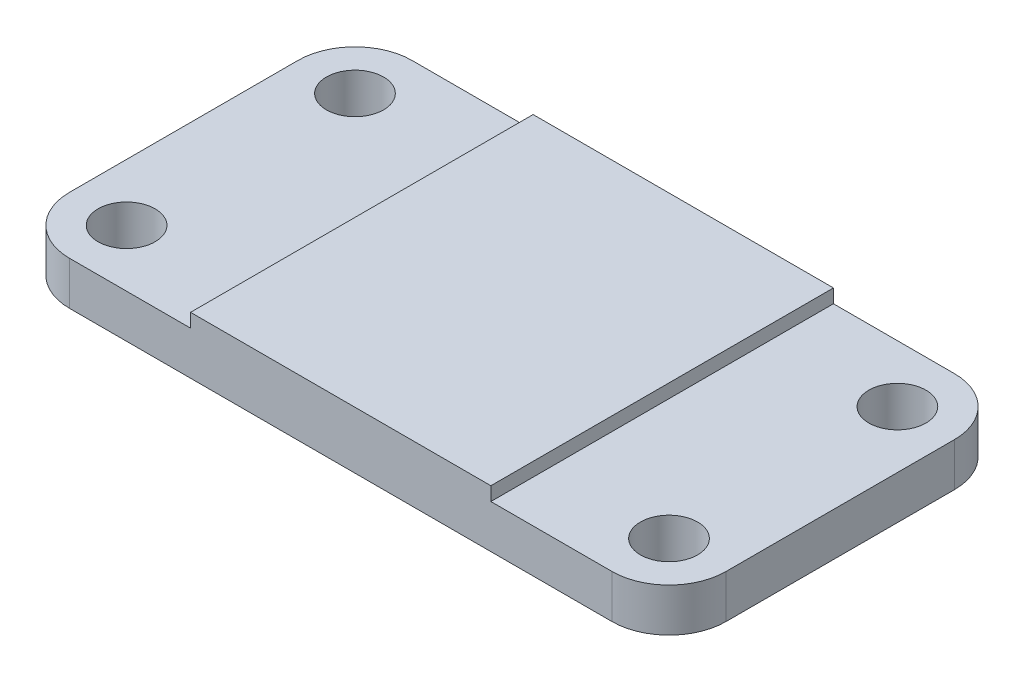
ISO-10303-21;
HEADER;
FILE_DESCRIPTION(('STEP AP214'),'2;1');
FILE_NAME('part.step','',(''),(''),'','','');
FILE_SCHEMA(('AUTOMOTIVE_DESIGN { 1 0 10303 214 1 1 1 1 }'));
ENDSEC;
DATA;
#1=APPLICATION_CONTEXT('core data for automotive mechanical design processes');
#2=APPLICATION_PROTOCOL_DEFINITION('international standard','automotive_design',2000,#1);
#3=PRODUCT_CONTEXT('',#1,'mechanical');
#4=PRODUCT('Part','Part','',(#3));
#5=PRODUCT_RELATED_PRODUCT_CATEGORY('part','',(#4));
#6=PRODUCT_DEFINITION_FORMATION('','',#4);
#7=PRODUCT_DEFINITION_CONTEXT('part definition',#1,'design');
#8=PRODUCT_DEFINITION('design','',#6,#7);
#9=PRODUCT_DEFINITION_SHAPE('','',#8);
#10=(LENGTH_UNIT() NAMED_UNIT(*) SI_UNIT(.MILLI.,.METRE.));
#11=(NAMED_UNIT(*) PLANE_ANGLE_UNIT() SI_UNIT($,.RADIAN.));
#12=(NAMED_UNIT(*) SI_UNIT($,.STERADIAN.) SOLID_ANGLE_UNIT());
#13=UNCERTAINTY_MEASURE_WITH_UNIT(LENGTH_MEASURE(1.E-05),#10,'distance_accuracy_value','');
#14=(GEOMETRIC_REPRESENTATION_CONTEXT(3) GLOBAL_UNCERTAINTY_ASSIGNED_CONTEXT((#13)) GLOBAL_UNIT_ASSIGNED_CONTEXT((#10,
#11,#12)) REPRESENTATION_CONTEXT('',''));
#15=CARTESIAN_POINT('',(0.,0.,0.));
#16=DIRECTION('',(0.,0.,1.));
#17=DIRECTION('',(1.,0.,0.));
#18=AXIS2_PLACEMENT_3D('',#15,#16,#17);
#19=CARTESIAN_POINT('',(0.,9.652,0.));
#20=DIRECTION('',(0.,-1.,0.));
#21=DIRECTION('',(0.,0.,-1.));
#22=AXIS2_PLACEMENT_3D('',#19,#20,#21);
#23=PLANE('',#22);
#24=CARTESIAN_POINT('',(60.325,9.652,25.4));
#25=DIRECTION('',(0.,1.,0.));
#26=DIRECTION('',(0.,0.,1.));
#27=AXIS2_PLACEMENT_3D('',#24,#25,#26);
#28=CIRCLE('',#27,6.34999999999999);
#29=CARTESIAN_POINT('',(60.325,9.652,31.75));
#30=VERTEX_POINT('',#29);
#31=EDGE_CURVE('E244',#30,#30,#28,.T.);
#32=ORIENTED_EDGE('',*,*,#31,.F.);
#33=EDGE_LOOP('',(#32));
#34=FACE_BOUND('',#33,.T.);
#35=CARTESIAN_POINT('',(60.325,9.652,-25.4));
#36=DIRECTION('',(0.,1.,0.));
#37=DIRECTION('',(0.,0.,1.));
#38=AXIS2_PLACEMENT_3D('',#35,#36,#37);
#39=CIRCLE('',#38,6.34999999999999);
#40=CARTESIAN_POINT('',(60.325,9.652,-19.05));
#41=VERTEX_POINT('',#40);
#42=EDGE_CURVE('E238',#41,#41,#39,.T.);
#43=ORIENTED_EDGE('',*,*,#42,.F.);
#44=EDGE_LOOP('',(#43));
#45=FACE_BOUND('',#44,.T.);
#46=DIRECTION('',(0.,0.,-1.));
#47=VECTOR('',#46,1.);
#48=CARTESIAN_POINT('',(73.025,9.652,38.1));
#49=LINE('',#48,#47);
#50=CARTESIAN_POINT('',(73.025,9.652,25.4));
#51=VERTEX_POINT('',#50);
#52=CARTESIAN_POINT('',(73.025,9.652,-25.4));
#53=VERTEX_POINT('',#52);
#54=EDGE_CURVE('E159',#51,#53,#49,.T.);
#55=ORIENTED_EDGE('',*,*,#54,.T.);
#56=CARTESIAN_POINT('',(60.325,9.652,-25.4));
#57=DIRECTION('',(0.,-1.,0.));
#58=DIRECTION('',(0.,0.,-1.));
#59=AXIS2_PLACEMENT_3D('',#56,#57,#58);
#60=CIRCLE('',#59,12.7);
#61=CARTESIAN_POINT('',(60.325,9.652,-38.1));
#62=VERTEX_POINT('',#61);
#63=EDGE_CURVE('E11',#53,#62,#60,.F.);
#64=ORIENTED_EDGE('',*,*,#63,.T.);
#65=DIRECTION('',(-1.,0.,0.));
#66=VECTOR('',#65,1.);
#67=CARTESIAN_POINT('',(-73.025,9.652,-38.1));
#68=LINE('',#67,#66);
#69=CARTESIAN_POINT('',(33.401,9.652,-38.1));
#70=VERTEX_POINT('',#69);
#71=EDGE_CURVE('E163',#62,#70,#68,.T.);
#72=ORIENTED_EDGE('',*,*,#71,.T.);
#73=DIRECTION('',(0.,0.,-1.));
#74=VECTOR('',#73,1.);
#75=CARTESIAN_POINT('',(33.401,9.652,-38.1));
#76=LINE('',#75,#74);
#77=CARTESIAN_POINT('',(33.401,9.652,38.1));
#78=VERTEX_POINT('',#77);
#79=EDGE_CURVE('E150',#78,#70,#76,.T.);
#80=ORIENTED_EDGE('',*,*,#79,.F.);
#81=DIRECTION('',(1.,0.,0.));
#82=VECTOR('',#81,1.);
#83=CARTESIAN_POINT('',(-73.025,9.652,38.1));
#84=LINE('',#83,#82);
#85=CARTESIAN_POINT('',(60.325,9.652,38.1));
#86=VERTEX_POINT('',#85);
#87=EDGE_CURVE('E168',#78,#86,#84,.T.);
#88=ORIENTED_EDGE('',*,*,#87,.T.);
#89=CARTESIAN_POINT('',(60.325,9.652,25.4));
#90=DIRECTION('',(0.,-1.,0.));
#91=DIRECTION('',(0.,0.,-1.));
#92=AXIS2_PLACEMENT_3D('',#89,#90,#91);
#93=CIRCLE('',#92,12.7);
#94=EDGE_CURVE('E43',#86,#51,#93,.F.);
#95=ORIENTED_EDGE('',*,*,#94,.T.);
#96=EDGE_LOOP('',(#55,#64,#72,#80,#88,#95));
#97=FACE_BOUND('',#96,.T.);
#98=ADVANCED_FACE('F35',(#34,#45,#97),#23,.F.);
#99=CARTESIAN_POINT('',(-60.325,9.652,-25.4));
#100=DIRECTION('',(0.,1.,0.));
#101=DIRECTION('',(0.,0.,1.));
#102=AXIS2_PLACEMENT_3D('',#99,#100,#101);
#103=CIRCLE('',#102,6.35);
#104=CARTESIAN_POINT('',(-60.325,9.652,-19.05));
#105=VERTEX_POINT('',#104);
#106=EDGE_CURVE('E256',#105,#105,#103,.T.);
#107=ORIENTED_EDGE('',*,*,#106,.F.);
#108=EDGE_LOOP('',(#107));
#109=FACE_BOUND('',#108,.T.);
#110=CARTESIAN_POINT('',(-60.325,9.652,25.4));
#111=DIRECTION('',(0.,1.,0.));
#112=DIRECTION('',(0.,0.,1.));
#113=AXIS2_PLACEMENT_3D('',#110,#111,#112);
#114=CIRCLE('',#113,6.35);
#115=CARTESIAN_POINT('',(-60.325,9.652,31.75));
#116=VERTEX_POINT('',#115);
#117=EDGE_CURVE('E250',#116,#116,#114,.T.);
#118=ORIENTED_EDGE('',*,*,#117,.F.);
#119=EDGE_LOOP('',(#118));
#120=FACE_BOUND('',#119,.T.);
#121=CARTESIAN_POINT('',(-33.401,9.652,-38.1));
#122=VERTEX_POINT('',#121);
#123=CARTESIAN_POINT('',(-60.325,9.652,-38.1));
#124=VERTEX_POINT('',#123);
#125=EDGE_CURVE('E161',#122,#124,#68,.T.);
#126=ORIENTED_EDGE('',*,*,#125,.T.);
#127=CARTESIAN_POINT('',(-60.325,9.652,-25.4));
#128=DIRECTION('',(0.,-1.,0.));
#129=DIRECTION('',(0.,0.,-1.));
#130=AXIS2_PLACEMENT_3D('',#127,#128,#129);
#131=CIRCLE('',#130,12.7);
#132=CARTESIAN_POINT('',(-73.025,9.652,-25.4));
#133=VERTEX_POINT('',#132);
#134=EDGE_CURVE('E197',#124,#133,#131,.F.);
#135=ORIENTED_EDGE('',*,*,#134,.T.);
#136=DIRECTION('',(0.,0.,1.));
#137=VECTOR('',#136,1.);
#138=CARTESIAN_POINT('',(-73.025,9.652,38.1));
#139=LINE('',#138,#137);
#140=CARTESIAN_POINT('',(-73.025,9.652,25.4));
#141=VERTEX_POINT('',#140);
#142=EDGE_CURVE('E165',#133,#141,#139,.T.);
#143=ORIENTED_EDGE('',*,*,#142,.T.);
#144=CARTESIAN_POINT('',(-60.325,9.652,25.4));
#145=DIRECTION('',(0.,-1.,0.));
#146=DIRECTION('',(0.,0.,-1.));
#147=AXIS2_PLACEMENT_3D('',#144,#145,#146);
#148=CIRCLE('',#147,12.7);
#149=CARTESIAN_POINT('',(-60.325,9.652,38.1));
#150=VERTEX_POINT('',#149);
#151=EDGE_CURVE('E195',#141,#150,#148,.F.);
#152=ORIENTED_EDGE('',*,*,#151,.T.);
#153=CARTESIAN_POINT('',(-33.401,9.652,38.1));
#154=VERTEX_POINT('',#153);
#155=EDGE_CURVE('E169',#150,#154,#84,.T.);
#156=ORIENTED_EDGE('',*,*,#155,.T.);
#157=DIRECTION('',(0.,0.,1.));
#158=VECTOR('',#157,1.);
#159=CARTESIAN_POINT('',(-33.401,9.652,-38.1));
#160=LINE('',#159,#158);
#161=EDGE_CURVE('E147',#122,#154,#160,.T.);
#162=ORIENTED_EDGE('',*,*,#161,.F.);
#163=EDGE_LOOP('',(#126,#135,#143,#152,#156,#162));
#164=FACE_BOUND('',#163,.T.);
#165=ADVANCED_FACE('F262',(#109,#120,#164),#23,.F.);
#166=CARTESIAN_POINT('',(73.025,9.652,38.1));
#167=DIRECTION('',(-1.,0.,0.));
#168=DIRECTION('',(0.,0.,1.));
#169=AXIS2_PLACEMENT_3D('',#166,#167,#168);
#170=PLANE('',#169);
#171=DIRECTION('',(0.,0.,-1.));
#172=VECTOR('',#171,1.);
#173=CARTESIAN_POINT('',(73.025,0.,38.1));
#174=LINE('',#173,#172);
#175=CARTESIAN_POINT('',(73.025,0.,25.4));
#176=VERTEX_POINT('',#175);
#177=CARTESIAN_POINT('',(73.025,0.,-25.4));
#178=VERTEX_POINT('',#177);
#179=EDGE_CURVE('E151',#176,#178,#174,.T.);
#180=ORIENTED_EDGE('',*,*,#179,.T.);
#181=DIRECTION('',(0.,-1.,0.));
#182=VECTOR('',#181,1.);
#183=CARTESIAN_POINT('',(73.025,9.652,-25.4));
#184=LINE('',#183,#182);
#185=EDGE_CURVE('E50',#178,#53,#184,.F.);
#186=ORIENTED_EDGE('',*,*,#185,.T.);
#187=ORIENTED_EDGE('',*,*,#54,.F.);
#188=DIRECTION('',(0.,-1.,0.));
#189=VECTOR('',#188,1.);
#190=CARTESIAN_POINT('',(73.025,9.652,25.4));
#191=LINE('',#190,#189);
#192=EDGE_CURVE('E204',#51,#176,#191,.T.);
#193=ORIENTED_EDGE('',*,*,#192,.T.);
#194=EDGE_LOOP('',(#180,#186,#187,#193));
#195=FACE_BOUND('',#194,.T.);
#196=ADVANCED_FACE('F209',(#195),#170,.F.);
#197=CARTESIAN_POINT('',(-73.025,9.652,-38.1));
#198=DIRECTION('',(0.,0.,1.));
#199=DIRECTION('',(1.,0.,0.));
#200=AXIS2_PLACEMENT_3D('',#197,#198,#199);
#201=PLANE('',#200);
#202=DIRECTION('',(-1.,0.,0.));
#203=VECTOR('',#202,1.);
#204=CARTESIAN_POINT('',(-73.025,0.,-38.1));
#205=LINE('',#204,#203);
#206=CARTESIAN_POINT('',(60.325,0.,-38.1));
#207=VERTEX_POINT('',#206);
#208=CARTESIAN_POINT('',(-60.325,0.,-38.1));
#209=VERTEX_POINT('',#208);
#210=EDGE_CURVE('E153',#207,#209,#205,.T.);
#211=ORIENTED_EDGE('',*,*,#210,.T.);
#212=DIRECTION('',(0.,-1.,0.));
#213=VECTOR('',#212,1.);
#214=CARTESIAN_POINT('',(-60.325,9.652,-38.1));
#215=LINE('',#214,#213);
#216=EDGE_CURVE('E193',#209,#124,#215,.F.);
#217=ORIENTED_EDGE('',*,*,#216,.T.);
#218=ORIENTED_EDGE('',*,*,#125,.F.);
#219=DIRECTION('',(0.,-1.,0.));
#220=VECTOR('',#219,1.);
#221=CARTESIAN_POINT('',(-33.401,12.7,-38.1));
#222=LINE('',#221,#220);
#223=CARTESIAN_POINT('',(-33.401,12.7,-38.1));
#224=VERTEX_POINT('',#223);
#225=EDGE_CURVE('E134',#224,#122,#222,.T.);
#226=ORIENTED_EDGE('',*,*,#225,.F.);
#227=DIRECTION('',(-1.,0.,0.));
#228=VECTOR('',#227,1.);
#229=CARTESIAN_POINT('',(-33.401,12.7,-38.1));
#230=LINE('',#229,#228);
#231=CARTESIAN_POINT('',(33.401,12.7,-38.1));
#232=VERTEX_POINT('',#231);
#233=EDGE_CURVE('E124',#232,#224,#230,.T.);
#234=ORIENTED_EDGE('',*,*,#233,.F.);
#235=DIRECTION('',(0.,-1.,0.));
#236=VECTOR('',#235,1.);
#237=CARTESIAN_POINT('',(33.401,12.7,-38.1));
#238=LINE('',#237,#236);
#239=EDGE_CURVE('E130',#232,#70,#238,.T.);
#240=ORIENTED_EDGE('',*,*,#239,.T.);
#241=ORIENTED_EDGE('',*,*,#71,.F.);
#242=DIRECTION('',(0.,-1.,0.));
#243=VECTOR('',#242,1.);
#244=CARTESIAN_POINT('',(60.325,9.652,-38.1));
#245=LINE('',#244,#243);
#246=EDGE_CURVE('E190',#62,#207,#245,.T.);
#247=ORIENTED_EDGE('',*,*,#246,.T.);
#248=EDGE_LOOP('',(#211,#217,#218,#226,#234,#240,#241,#247));
#249=FACE_BOUND('',#248,.T.);
#250=ADVANCED_FACE('F127',(#249),#201,.F.);
#251=CARTESIAN_POINT('',(-73.025,9.652,38.1));
#252=DIRECTION('',(1.,0.,0.));
#253=DIRECTION('',(0.,0.,-1.));
#254=AXIS2_PLACEMENT_3D('',#251,#252,#253);
#255=PLANE('',#254);
#256=ORIENTED_EDGE('',*,*,#142,.F.);
#257=DIRECTION('',(0.,-1.,0.));
#258=VECTOR('',#257,1.);
#259=CARTESIAN_POINT('',(-73.025,9.652,-25.4));
#260=LINE('',#259,#258);
#261=CARTESIAN_POINT('',(-73.025,0.,-25.4));
#262=VERTEX_POINT('',#261);
#263=EDGE_CURVE('E179',#133,#262,#260,.T.);
#264=ORIENTED_EDGE('',*,*,#263,.T.);
#265=DIRECTION('',(0.,0.,1.));
#266=VECTOR('',#265,1.);
#267=CARTESIAN_POINT('',(-73.025,0.,38.1));
#268=LINE('',#267,#266);
#269=CARTESIAN_POINT('',(-73.025,0.,25.4));
#270=VERTEX_POINT('',#269);
#271=EDGE_CURVE('E173',#262,#270,#268,.T.);
#272=ORIENTED_EDGE('',*,*,#271,.T.);
#273=DIRECTION('',(0.,-1.,0.));
#274=VECTOR('',#273,1.);
#275=CARTESIAN_POINT('',(-73.025,9.652,25.4));
#276=LINE('',#275,#274);
#277=EDGE_CURVE('E170',#270,#141,#276,.F.);
#278=ORIENTED_EDGE('',*,*,#277,.T.);
#279=EDGE_LOOP('',(#256,#264,#272,#278));
#280=FACE_BOUND('',#279,.T.);
#281=ADVANCED_FACE('F275',(#280),#255,.F.);
#282=CARTESIAN_POINT('',(-73.025,9.652,38.1));
#283=DIRECTION('',(0.,0.,-1.));
#284=DIRECTION('',(-1.,0.,0.));
#285=AXIS2_PLACEMENT_3D('',#282,#283,#284);
#286=PLANE('',#285);
#287=ORIENTED_EDGE('',*,*,#155,.F.);
#288=DIRECTION('',(0.,-1.,0.));
#289=VECTOR('',#288,1.);
#290=CARTESIAN_POINT('',(-60.325,9.652,38.1));
#291=LINE('',#290,#289);
#292=CARTESIAN_POINT('',(-60.325,0.,38.1));
#293=VERTEX_POINT('',#292);
#294=EDGE_CURVE('E201',#150,#293,#291,.T.);
#295=ORIENTED_EDGE('',*,*,#294,.T.);
#296=DIRECTION('',(1.,0.,0.));
#297=VECTOR('',#296,1.);
#298=CARTESIAN_POINT('',(-73.025,0.,38.1));
#299=LINE('',#298,#297);
#300=CARTESIAN_POINT('',(60.325,0.,38.1));
#301=VERTEX_POINT('',#300);
#302=EDGE_CURVE('E162',#293,#301,#299,.T.);
#303=ORIENTED_EDGE('',*,*,#302,.T.);
#304=DIRECTION('',(0.,-1.,0.));
#305=VECTOR('',#304,1.);
#306=CARTESIAN_POINT('',(60.325,9.652,38.1));
#307=LINE('',#306,#305);
#308=EDGE_CURVE('E199',#301,#86,#307,.F.);
#309=ORIENTED_EDGE('',*,*,#308,.T.);
#310=ORIENTED_EDGE('',*,*,#87,.F.);
#311=DIRECTION('',(0.,-1.,0.));
#312=VECTOR('',#311,1.);
#313=CARTESIAN_POINT('',(33.401,12.7,38.1));
#314=LINE('',#313,#312);
#315=CARTESIAN_POINT('',(33.401,12.7,38.1));
#316=VERTEX_POINT('',#315);
#317=EDGE_CURVE('E227',#316,#78,#314,.T.);
#318=ORIENTED_EDGE('',*,*,#317,.F.);
#319=DIRECTION('',(1.,0.,0.));
#320=VECTOR('',#319,1.);
#321=CARTESIAN_POINT('',(-33.401,12.7,38.1));
#322=LINE('',#321,#320);
#323=CARTESIAN_POINT('',(-33.401,12.7,38.1));
#324=VERTEX_POINT('',#323);
#325=EDGE_CURVE('E143',#324,#316,#322,.T.);
#326=ORIENTED_EDGE('',*,*,#325,.F.);
#327=DIRECTION('',(0.,-1.,0.));
#328=VECTOR('',#327,1.);
#329=CARTESIAN_POINT('',(-33.401,12.7,38.1));
#330=LINE('',#329,#328);
#331=EDGE_CURVE('E155',#324,#154,#330,.T.);
#332=ORIENTED_EDGE('',*,*,#331,.T.);
#333=EDGE_LOOP('',(#287,#295,#303,#309,#310,#318,#326,#332));
#334=FACE_BOUND('',#333,.T.);
#335=ADVANCED_FACE('F226',(#334),#286,.F.);
#336=CARTESIAN_POINT('',(0.,0.,0.));
#337=DIRECTION('',(0.,-1.,0.));
#338=DIRECTION('',(0.,0.,-1.));
#339=AXIS2_PLACEMENT_3D('',#336,#337,#338);
#340=PLANE('',#339);
#341=CARTESIAN_POINT('',(-60.325,0.,-25.4));
#342=DIRECTION('',(0.,1.,0.));
#343=DIRECTION('',(0.,0.,1.));
#344=AXIS2_PLACEMENT_3D('',#341,#342,#343);
#345=CIRCLE('',#344,6.35);
#346=CARTESIAN_POINT('',(-60.325,0.,-19.05));
#347=VERTEX_POINT('',#346);
#348=EDGE_CURVE('E253',#347,#347,#345,.T.);
#349=ORIENTED_EDGE('',*,*,#348,.T.);
#350=EDGE_LOOP('',(#349));
#351=FACE_BOUND('',#350,.T.);
#352=CARTESIAN_POINT('',(-60.325,0.,25.4));
#353=DIRECTION('',(0.,1.,0.));
#354=DIRECTION('',(0.,0.,1.));
#355=AXIS2_PLACEMENT_3D('',#352,#353,#354);
#356=CIRCLE('',#355,6.35);
#357=CARTESIAN_POINT('',(-60.325,0.,31.75));
#358=VERTEX_POINT('',#357);
#359=EDGE_CURVE('E247',#358,#358,#356,.T.);
#360=ORIENTED_EDGE('',*,*,#359,.T.);
#361=EDGE_LOOP('',(#360));
#362=FACE_BOUND('',#361,.T.);
#363=CARTESIAN_POINT('',(60.325,0.,25.4));
#364=DIRECTION('',(0.,1.,0.));
#365=DIRECTION('',(0.,0.,1.));
#366=AXIS2_PLACEMENT_3D('',#363,#364,#365);
#367=CIRCLE('',#366,6.34999999999999);
#368=CARTESIAN_POINT('',(60.325,0.,31.75));
#369=VERTEX_POINT('',#368);
#370=EDGE_CURVE('E241',#369,#369,#367,.T.);
#371=ORIENTED_EDGE('',*,*,#370,.T.);
#372=EDGE_LOOP('',(#371));
#373=FACE_BOUND('',#372,.T.);
#374=CARTESIAN_POINT('',(60.325,0.,-25.4));
#375=DIRECTION('',(0.,1.,0.));
#376=DIRECTION('',(0.,0.,1.));
#377=AXIS2_PLACEMENT_3D('',#374,#375,#376);
#378=CIRCLE('',#377,6.34999999999999);
#379=CARTESIAN_POINT('',(60.325,0.,-19.05));
#380=VERTEX_POINT('',#379);
#381=EDGE_CURVE('E222',#380,#380,#378,.T.);
#382=ORIENTED_EDGE('',*,*,#381,.T.);
#383=EDGE_LOOP('',(#382));
#384=FACE_BOUND('',#383,.T.);
#385=ORIENTED_EDGE('',*,*,#271,.F.);
#386=CARTESIAN_POINT('',(-60.325,0.,-25.4));
#387=DIRECTION('',(0.,-1.,0.));
#388=DIRECTION('',(0.,0.,-1.));
#389=AXIS2_PLACEMENT_3D('',#386,#387,#388);
#390=CIRCLE('',#389,12.7);
#391=EDGE_CURVE('E188',#262,#209,#390,.T.);
#392=ORIENTED_EDGE('',*,*,#391,.T.);
#393=ORIENTED_EDGE('',*,*,#210,.F.);
#394=CARTESIAN_POINT('',(60.325,0.,-25.4));
#395=DIRECTION('',(0.,-1.,0.));
#396=DIRECTION('',(0.,0.,-1.));
#397=AXIS2_PLACEMENT_3D('',#394,#395,#396);
#398=CIRCLE('',#397,12.7);
#399=EDGE_CURVE('E184',#207,#178,#398,.T.);
#400=ORIENTED_EDGE('',*,*,#399,.T.);
#401=ORIENTED_EDGE('',*,*,#179,.F.);
#402=CARTESIAN_POINT('',(60.325,0.,25.4));
#403=DIRECTION('',(0.,-1.,0.));
#404=DIRECTION('',(0.,0.,-1.));
#405=AXIS2_PLACEMENT_3D('',#402,#403,#404);
#406=CIRCLE('',#405,12.7);
#407=EDGE_CURVE('E182',#176,#301,#406,.T.);
#408=ORIENTED_EDGE('',*,*,#407,.T.);
#409=ORIENTED_EDGE('',*,*,#302,.F.);
#410=CARTESIAN_POINT('',(-60.325,0.,25.4));
#411=DIRECTION('',(0.,-1.,0.));
#412=DIRECTION('',(0.,0.,-1.));
#413=AXIS2_PLACEMENT_3D('',#410,#411,#412);
#414=CIRCLE('',#413,12.7);
#415=EDGE_CURVE('E186',#293,#270,#414,.T.);
#416=ORIENTED_EDGE('',*,*,#415,.T.);
#417=EDGE_LOOP('',(#385,#392,#393,#400,#401,#408,#409,#416));
#418=FACE_BOUND('',#417,.T.);
#419=ADVANCED_FACE('F213',(#351,#362,#373,#384,#418),#340,.T.);
#420=CARTESIAN_POINT('',(33.401,12.7,-38.1));
#421=DIRECTION('',(-1.,0.,0.));
#422=DIRECTION('',(0.,0.,1.));
#423=AXIS2_PLACEMENT_3D('',#420,#421,#422);
#424=PLANE('',#423);
#425=ORIENTED_EDGE('',*,*,#79,.T.);
#426=ORIENTED_EDGE('',*,*,#239,.F.);
#427=DIRECTION('',(0.,0.,-1.));
#428=VECTOR('',#427,1.);
#429=CARTESIAN_POINT('',(33.401,12.7,-38.1));
#430=LINE('',#429,#428);
#431=EDGE_CURVE('E138',#316,#232,#430,.T.);
#432=ORIENTED_EDGE('',*,*,#431,.F.);
#433=ORIENTED_EDGE('',*,*,#317,.T.);
#434=EDGE_LOOP('',(#425,#426,#432,#433));
#435=FACE_BOUND('',#434,.T.);
#436=ADVANCED_FACE('F149',(#435),#424,.F.);
#437=CARTESIAN_POINT('',(-33.401,12.7,-38.1));
#438=DIRECTION('',(1.,0.,0.));
#439=DIRECTION('',(0.,0.,-1.));
#440=AXIS2_PLACEMENT_3D('',#437,#438,#439);
#441=PLANE('',#440);
#442=ORIENTED_EDGE('',*,*,#161,.T.);
#443=ORIENTED_EDGE('',*,*,#331,.F.);
#444=DIRECTION('',(0.,0.,1.));
#445=VECTOR('',#444,1.);
#446=CARTESIAN_POINT('',(-33.401,12.7,-38.1));
#447=LINE('',#446,#445);
#448=EDGE_CURVE('E137',#224,#324,#447,.T.);
#449=ORIENTED_EDGE('',*,*,#448,.F.);
#450=ORIENTED_EDGE('',*,*,#225,.T.);
#451=EDGE_LOOP('',(#442,#443,#449,#450));
#452=FACE_BOUND('',#451,.T.);
#453=ADVANCED_FACE('F283',(#452),#441,.F.);
#454=CARTESIAN_POINT('',(0.,12.7,0.));
#455=DIRECTION('',(0.,1.,0.));
#456=DIRECTION('',(0.,0.,1.));
#457=AXIS2_PLACEMENT_3D('',#454,#455,#456);
#458=PLANE('',#457);
#459=ORIENTED_EDGE('',*,*,#431,.T.);
#460=ORIENTED_EDGE('',*,*,#233,.T.);
#461=ORIENTED_EDGE('',*,*,#448,.T.);
#462=ORIENTED_EDGE('',*,*,#325,.T.);
#463=EDGE_LOOP('',(#459,#460,#461,#462));
#464=FACE_BOUND('',#463,.T.);
#465=ADVANCED_FACE('F141',(#464),#458,.T.);
#466=CARTESIAN_POINT('',(-60.325,9.652,-25.4));
#467=DIRECTION('',(0.,-1.,0.));
#468=DIRECTION('',(0.,0.,-1.));
#469=AXIS2_PLACEMENT_3D('',#466,#467,#468);
#470=CYLINDRICAL_SURFACE('',#469,12.7);
#471=ORIENTED_EDGE('',*,*,#134,.F.);
#472=ORIENTED_EDGE('',*,*,#216,.F.);
#473=ORIENTED_EDGE('',*,*,#391,.F.);
#474=ORIENTED_EDGE('',*,*,#263,.F.);
#475=EDGE_LOOP('',(#471,#472,#473,#474));
#476=FACE_BOUND('',#475,.T.);
#477=ADVANCED_FACE('F273',(#476),#470,.T.);
#478=CARTESIAN_POINT('',(-60.325,9.652,25.4));
#479=DIRECTION('',(0.,-1.,0.));
#480=DIRECTION('',(0.,0.,-1.));
#481=AXIS2_PLACEMENT_3D('',#478,#479,#480);
#482=CYLINDRICAL_SURFACE('',#481,12.7);
#483=ORIENTED_EDGE('',*,*,#151,.F.);
#484=ORIENTED_EDGE('',*,*,#277,.F.);
#485=ORIENTED_EDGE('',*,*,#415,.F.);
#486=ORIENTED_EDGE('',*,*,#294,.F.);
#487=EDGE_LOOP('',(#483,#484,#485,#486));
#488=FACE_BOUND('',#487,.T.);
#489=ADVANCED_FACE('F280',(#488),#482,.T.);
#490=CARTESIAN_POINT('',(60.325,9.652,-25.4));
#491=DIRECTION('',(0.,-1.,0.));
#492=DIRECTION('',(0.,0.,-1.));
#493=AXIS2_PLACEMENT_3D('',#490,#491,#492);
#494=CYLINDRICAL_SURFACE('',#493,12.7);
#495=ORIENTED_EDGE('',*,*,#63,.F.);
#496=ORIENTED_EDGE('',*,*,#185,.F.);
#497=ORIENTED_EDGE('',*,*,#399,.F.);
#498=ORIENTED_EDGE('',*,*,#246,.F.);
#499=EDGE_LOOP('',(#495,#496,#497,#498));
#500=FACE_BOUND('',#499,.T.);
#501=ADVANCED_FACE('F219',(#500),#494,.T.);
#502=CARTESIAN_POINT('',(60.325,9.652,25.4));
#503=DIRECTION('',(0.,-1.,0.));
#504=DIRECTION('',(0.,0.,-1.));
#505=AXIS2_PLACEMENT_3D('',#502,#503,#504);
#506=CYLINDRICAL_SURFACE('',#505,12.7);
#507=ORIENTED_EDGE('',*,*,#94,.F.);
#508=ORIENTED_EDGE('',*,*,#308,.F.);
#509=ORIENTED_EDGE('',*,*,#407,.F.);
#510=ORIENTED_EDGE('',*,*,#192,.F.);
#511=EDGE_LOOP('',(#507,#508,#509,#510));
#512=FACE_BOUND('',#511,.T.);
#513=ADVANCED_FACE('F37',(#512),#506,.T.);
#514=CARTESIAN_POINT('',(60.325,9.652,-25.4));
#515=DIRECTION('',(0.,1.,0.));
#516=DIRECTION('',(0.,0.,1.));
#517=AXIS2_PLACEMENT_3D('',#514,#515,#516);
#518=CYLINDRICAL_SURFACE('',#517,6.34999999999999);
#519=ORIENTED_EDGE('',*,*,#381,.F.);
#520=EDGE_LOOP('',(#519));
#521=FACE_BOUND('',#520,.T.);
#522=ORIENTED_EDGE('',*,*,#42,.T.);
#523=EDGE_LOOP('',(#522));
#524=FACE_BOUND('',#523,.T.);
#525=ADVANCED_FACE('F317',(#521,#524),#518,.F.);
#526=CARTESIAN_POINT('',(60.325,9.652,25.4));
#527=DIRECTION('',(0.,1.,0.));
#528=DIRECTION('',(0.,0.,1.));
#529=AXIS2_PLACEMENT_3D('',#526,#527,#528);
#530=CYLINDRICAL_SURFACE('',#529,6.34999999999999);
#531=ORIENTED_EDGE('',*,*,#370,.F.);
#532=EDGE_LOOP('',(#531));
#533=FACE_BOUND('',#532,.T.);
#534=ORIENTED_EDGE('',*,*,#31,.T.);
#535=EDGE_LOOP('',(#534));
#536=FACE_BOUND('',#535,.T.);
#537=ADVANCED_FACE('F321',(#533,#536),#530,.F.);
#538=CARTESIAN_POINT('',(-60.325,9.652,25.4));
#539=DIRECTION('',(0.,1.,0.));
#540=DIRECTION('',(0.,0.,1.));
#541=AXIS2_PLACEMENT_3D('',#538,#539,#540);
#542=CYLINDRICAL_SURFACE('',#541,6.35);
#543=ORIENTED_EDGE('',*,*,#359,.F.);
#544=EDGE_LOOP('',(#543));
#545=FACE_BOUND('',#544,.T.);
#546=ORIENTED_EDGE('',*,*,#117,.T.);
#547=EDGE_LOOP('',(#546));
#548=FACE_BOUND('',#547,.T.);
#549=ADVANCED_FACE('F327',(#545,#548),#542,.F.);
#550=CARTESIAN_POINT('',(-60.325,9.652,-25.4));
#551=DIRECTION('',(0.,1.,0.));
#552=DIRECTION('',(0.,0.,1.));
#553=AXIS2_PLACEMENT_3D('',#550,#551,#552);
#554=CYLINDRICAL_SURFACE('',#553,6.35);
#555=ORIENTED_EDGE('',*,*,#348,.F.);
#556=EDGE_LOOP('',(#555));
#557=FACE_BOUND('',#556,.T.);
#558=ORIENTED_EDGE('',*,*,#106,.T.);
#559=EDGE_LOOP('',(#558));
#560=FACE_BOUND('',#559,.T.);
#561=ADVANCED_FACE('F260',(#557,#560),#554,.F.);
#562=CLOSED_SHELL('',(#98,#165,#196,#250,#281,#335,#419,#436,#453,#465,#477,#489,#501,#513,#525,
#537,#549,#561));
#563=MANIFOLD_SOLID_BREP('B2',#562);
#564=ADVANCED_BREP_SHAPE_REPRESENTATION('',(#18,#563),#14);
#565=SHAPE_DEFINITION_REPRESENTATION(#9,#564);
ENDSEC;
END-ISO-10303-21;
